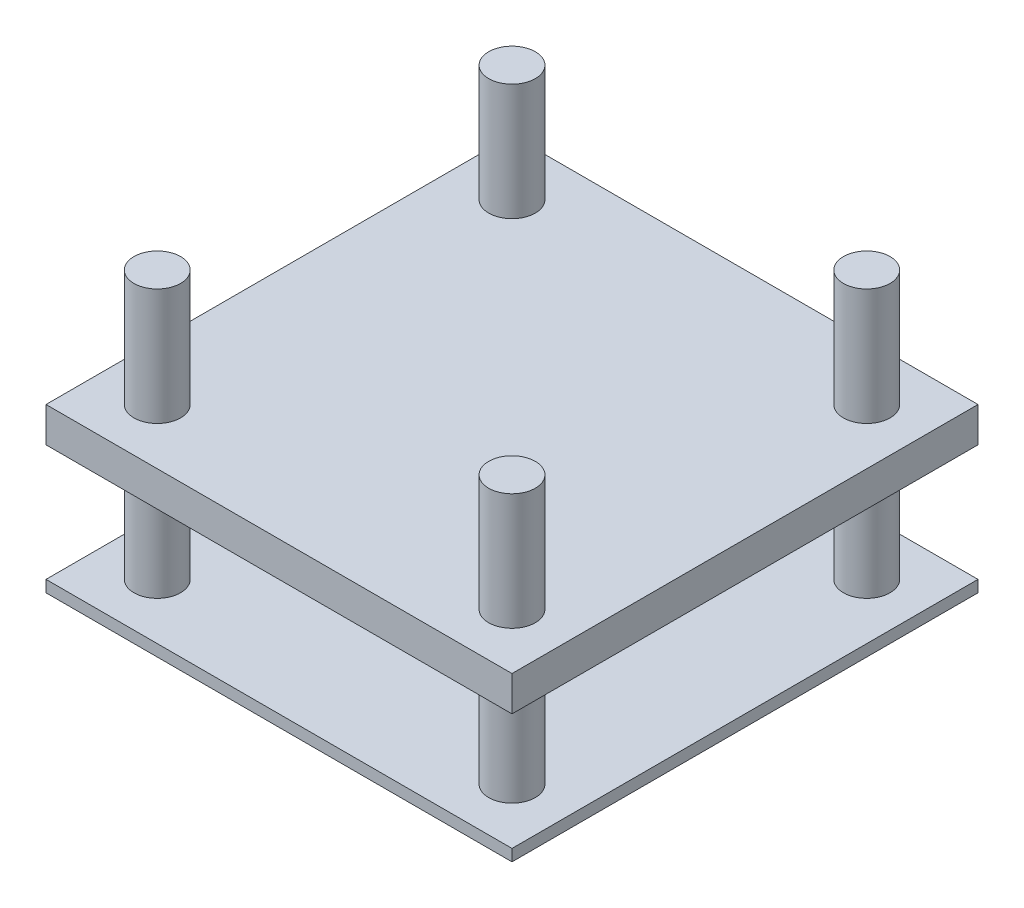
ISO-10303-21;
HEADER;
FILE_DESCRIPTION(('STEP AP214'),'2;1');
FILE_NAME('part.step','',(''),(''),'','','');
FILE_SCHEMA(('AUTOMOTIVE_DESIGN { 1 0 10303 214 1 1 1 1 }'));
ENDSEC;
DATA;
#1=APPLICATION_CONTEXT('core data for automotive mechanical design processes');
#2=APPLICATION_PROTOCOL_DEFINITION('international standard','automotive_design',2000,#1);
#3=PRODUCT_CONTEXT('',#1,'mechanical');
#4=PRODUCT('Part','Part','',(#3));
#5=PRODUCT_RELATED_PRODUCT_CATEGORY('part','',(#4));
#6=PRODUCT_DEFINITION_FORMATION('','',#4);
#7=PRODUCT_DEFINITION_CONTEXT('part definition',#1,'design');
#8=PRODUCT_DEFINITION('design','',#6,#7);
#9=PRODUCT_DEFINITION_SHAPE('','',#8);
#10=(LENGTH_UNIT() NAMED_UNIT(*) SI_UNIT(.MILLI.,.METRE.));
#11=(NAMED_UNIT(*) PLANE_ANGLE_UNIT() SI_UNIT($,.RADIAN.));
#12=(NAMED_UNIT(*) SI_UNIT($,.STERADIAN.) SOLID_ANGLE_UNIT());
#13=UNCERTAINTY_MEASURE_WITH_UNIT(LENGTH_MEASURE(1.E-05),#10,'distance_accuracy_value','');
#14=(GEOMETRIC_REPRESENTATION_CONTEXT(3) GLOBAL_UNCERTAINTY_ASSIGNED_CONTEXT((#13)) GLOBAL_UNIT_ASSIGNED_CONTEXT((#10,
#11,#12)) REPRESENTATION_CONTEXT('',''));
#15=CARTESIAN_POINT('',(0.,0.,0.));
#16=DIRECTION('',(0.,0.,1.));
#17=DIRECTION('',(1.,0.,0.));
#18=AXIS2_PLACEMENT_3D('',#15,#16,#17);
#19=CARTESIAN_POINT('',(0.,1.,0.));
#20=DIRECTION('',(0.,1.,0.));
#21=DIRECTION('',(0.,0.,1.));
#22=AXIS2_PLACEMENT_3D('',#19,#20,#21);
#23=PLANE('',#22);
#24=CARTESIAN_POINT('',(-15.2247989874837,1.,-15.2247989874837));
#25=DIRECTION('',(0.,1.,0.));
#26=DIRECTION('',(0.,0.,1.));
#27=AXIS2_PLACEMENT_3D('',#24,#25,#26);
#28=CIRCLE('',#27,2.);
#29=CARTESIAN_POINT('',(-15.2247989874837,1.,-13.2247989874837));
#30=VERTEX_POINT('',#29);
#31=EDGE_CURVE('E248',#30,#30,#28,.F.);
#32=ORIENTED_EDGE('',*,*,#31,.T.);
#33=EDGE_LOOP('',(#32));
#34=FACE_BOUND('',#33,.T.);
#35=CARTESIAN_POINT('',(15.2247989874837,1.,-15.2247989874837));
#36=DIRECTION('',(0.,1.,0.));
#37=DIRECTION('',(0.,0.,1.));
#38=AXIS2_PLACEMENT_3D('',#35,#36,#37);
#39=CIRCLE('',#38,2.);
#40=CARTESIAN_POINT('',(15.2247989874837,1.,-13.2247989874837));
#41=VERTEX_POINT('',#40);
#42=EDGE_CURVE('E245',#41,#41,#39,.F.);
#43=ORIENTED_EDGE('',*,*,#42,.T.);
#44=EDGE_LOOP('',(#43));
#45=FACE_BOUND('',#44,.T.);
#46=CARTESIAN_POINT('',(15.2247989874837,1.,15.2247989874837));
#47=DIRECTION('',(0.,1.,0.));
#48=DIRECTION('',(0.,0.,1.));
#49=AXIS2_PLACEMENT_3D('',#46,#47,#48);
#50=CIRCLE('',#49,2.);
#51=CARTESIAN_POINT('',(15.2247989874837,1.,17.2247989874837));
#52=VERTEX_POINT('',#51);
#53=EDGE_CURVE('E242',#52,#52,#50,.F.);
#54=ORIENTED_EDGE('',*,*,#53,.T.);
#55=EDGE_LOOP('',(#54));
#56=FACE_BOUND('',#55,.T.);
#57=CARTESIAN_POINT('',(-15.2247989874837,1.,15.2247989874837));
#58=DIRECTION('',(0.,1.,0.));
#59=DIRECTION('',(0.,0.,1.));
#60=AXIS2_PLACEMENT_3D('',#57,#58,#59);
#61=CIRCLE('',#60,2.);
#62=CARTESIAN_POINT('',(-15.2247989874837,1.,17.2247989874837));
#63=VERTEX_POINT('',#62);
#64=EDGE_CURVE('E251',#63,#63,#61,.F.);
#65=ORIENTED_EDGE('',*,*,#64,.T.);
#66=EDGE_LOOP('',(#65));
#67=FACE_BOUND('',#66,.T.);
#68=DIRECTION('',(1.,0.,0.));
#69=VECTOR('',#68,1.);
#70=CARTESIAN_POINT('',(-20.,1.,20.));
#71=LINE('',#70,#69);
#72=CARTESIAN_POINT('',(-20.,1.,20.));
#73=VERTEX_POINT('',#72);
#74=CARTESIAN_POINT('',(20.,1.,20.));
#75=VERTEX_POINT('',#74);
#76=EDGE_CURVE('E255',#73,#75,#71,.T.);
#77=ORIENTED_EDGE('',*,*,#76,.T.);
#78=DIRECTION('',(0.,0.,-1.));
#79=VECTOR('',#78,1.);
#80=CARTESIAN_POINT('',(20.,1.,20.));
#81=LINE('',#80,#79);
#82=CARTESIAN_POINT('',(20.,1.,-20.));
#83=VERTEX_POINT('',#82);
#84=EDGE_CURVE('E258',#75,#83,#81,.T.);
#85=ORIENTED_EDGE('',*,*,#84,.T.);
#86=DIRECTION('',(1.,0.,0.));
#87=VECTOR('',#86,1.);
#88=CARTESIAN_POINT('',(-20.,1.,-20.));
#89=LINE('',#88,#87);
#90=CARTESIAN_POINT('',(-20.,1.,-20.));
#91=VERTEX_POINT('',#90);
#92=EDGE_CURVE('E261',#91,#83,#89,.T.);
#93=ORIENTED_EDGE('',*,*,#92,.F.);
#94=DIRECTION('',(0.,0.,-1.));
#95=VECTOR('',#94,1.);
#96=CARTESIAN_POINT('',(-20.,1.,20.));
#97=LINE('',#96,#95);
#98=EDGE_CURVE('E264',#73,#91,#97,.T.);
#99=ORIENTED_EDGE('',*,*,#98,.F.);
#100=EDGE_LOOP('',(#77,#85,#93,#99));
#101=FACE_BOUND('',#100,.T.);
#102=DIRECTION('',(0.,0.,1.));
#103=VECTOR('',#102,1.);
#104=CARTESIAN_POINT('',(9.75,1.,0.));
#105=LINE('',#104,#103);
#106=CARTESIAN_POINT('',(9.75,0.999999999999999,-9.75));
#107=VERTEX_POINT('',#106);
#108=CARTESIAN_POINT('',(9.75,0.999999999999999,9.75));
#109=VERTEX_POINT('',#108);
#110=EDGE_CURVE('E158',#107,#109,#105,.T.);
#111=ORIENTED_EDGE('',*,*,#110,.T.);
#112=DIRECTION('',(-1.,0.,0.));
#113=VECTOR('',#112,1.);
#114=CARTESIAN_POINT('',(0.,1.,9.75));
#115=LINE('',#114,#113);
#116=CARTESIAN_POINT('',(-9.75,0.999999999999999,9.75));
#117=VERTEX_POINT('',#116);
#118=EDGE_CURVE('E129',#109,#117,#115,.T.);
#119=ORIENTED_EDGE('',*,*,#118,.T.);
#120=DIRECTION('',(0.,0.,1.));
#121=VECTOR('',#120,1.);
#122=CARTESIAN_POINT('',(-9.75,1.,0.));
#123=LINE('',#122,#121);
#124=CARTESIAN_POINT('',(-9.75,1.,-9.75));
#125=VERTEX_POINT('',#124);
#126=EDGE_CURVE('E132',#125,#117,#123,.T.);
#127=ORIENTED_EDGE('',*,*,#126,.F.);
#128=DIRECTION('',(-1.,0.,0.));
#129=VECTOR('',#128,1.);
#130=CARTESIAN_POINT('',(0.,1.,-9.75));
#131=LINE('',#130,#129);
#132=EDGE_CURVE('E156',#107,#125,#131,.T.);
#133=ORIENTED_EDGE('',*,*,#132,.F.);
#134=EDGE_LOOP('',(#111,#119,#127,#133));
#135=FACE_BOUND('',#134,.T.);
#136=ADVANCED_FACE('F37',(#34,#45,#56,#67,#101,#135),#23,.T.);
#137=CARTESIAN_POINT('',(0.,0.,0.));
#138=DIRECTION('',(0.,1.,0.));
#139=DIRECTION('',(0.,0.,1.));
#140=AXIS2_PLACEMENT_3D('',#137,#138,#139);
#141=PLANE('',#140);
#142=DIRECTION('',(1.,0.,0.));
#143=VECTOR('',#142,1.);
#144=CARTESIAN_POINT('',(-20.,0.,20.));
#145=LINE('',#144,#143);
#146=CARTESIAN_POINT('',(-20.,0.,20.));
#147=VERTEX_POINT('',#146);
#148=CARTESIAN_POINT('',(20.,0.,20.));
#149=VERTEX_POINT('',#148);
#150=EDGE_CURVE('E254',#147,#149,#145,.T.);
#151=ORIENTED_EDGE('',*,*,#150,.F.);
#152=DIRECTION('',(0.,0.,-1.));
#153=VECTOR('',#152,1.);
#154=CARTESIAN_POINT('',(-20.,0.,20.));
#155=LINE('',#154,#153);
#156=CARTESIAN_POINT('',(-20.,0.,-20.));
#157=VERTEX_POINT('',#156);
#158=EDGE_CURVE('E259',#147,#157,#155,.T.);
#159=ORIENTED_EDGE('',*,*,#158,.T.);
#160=DIRECTION('',(1.,0.,0.));
#161=VECTOR('',#160,1.);
#162=CARTESIAN_POINT('',(-20.,0.,-20.));
#163=LINE('',#162,#161);
#164=CARTESIAN_POINT('',(20.,0.,-20.));
#165=VERTEX_POINT('',#164);
#166=EDGE_CURVE('E273',#157,#165,#163,.T.);
#167=ORIENTED_EDGE('',*,*,#166,.T.);
#168=DIRECTION('',(0.,0.,-1.));
#169=VECTOR('',#168,1.);
#170=CARTESIAN_POINT('',(20.,0.,20.));
#171=LINE('',#170,#169);
#172=EDGE_CURVE('E270',#149,#165,#171,.T.);
#173=ORIENTED_EDGE('',*,*,#172,.F.);
#174=EDGE_LOOP('',(#151,#159,#167,#173));
#175=FACE_BOUND('',#174,.T.);
#176=CARTESIAN_POINT('',(15.2247989874837,0.,-15.2247989874837));
#177=DIRECTION('',(0.,1.,0.));
#178=DIRECTION('',(0.,0.,1.));
#179=AXIS2_PLACEMENT_3D('',#176,#177,#178);
#180=CIRCLE('',#179,2.);
#181=CARTESIAN_POINT('',(15.2247989874837,0.,-13.2247989874837));
#182=VERTEX_POINT('',#181);
#183=EDGE_CURVE('E170',#182,#182,#180,.T.);
#184=ORIENTED_EDGE('',*,*,#183,.T.);
#185=EDGE_LOOP('',(#184));
#186=FACE_BOUND('',#185,.T.);
#187=CARTESIAN_POINT('',(-15.2247989874837,0.,-15.2247989874837));
#188=DIRECTION('',(0.,1.,0.));
#189=DIRECTION('',(0.,0.,1.));
#190=AXIS2_PLACEMENT_3D('',#187,#188,#189);
#191=CIRCLE('',#190,2.);
#192=CARTESIAN_POINT('',(-15.2247989874837,0.,-13.2247989874837));
#193=VERTEX_POINT('',#192);
#194=EDGE_CURVE('E286',#193,#193,#191,.F.);
#195=ORIENTED_EDGE('',*,*,#194,.F.);
#196=EDGE_LOOP('',(#195));
#197=FACE_BOUND('',#196,.T.);
#198=CARTESIAN_POINT('',(-15.2247989874837,0.,15.2247989874837));
#199=DIRECTION('',(0.,1.,0.));
#200=DIRECTION('',(0.,0.,1.));
#201=AXIS2_PLACEMENT_3D('',#198,#199,#200);
#202=CIRCLE('',#201,2.);
#203=CARTESIAN_POINT('',(-15.2247989874837,0.,17.2247989874837));
#204=VERTEX_POINT('',#203);
#205=EDGE_CURVE('E45',#204,#204,#202,.F.);
#206=ORIENTED_EDGE('',*,*,#205,.F.);
#207=EDGE_LOOP('',(#206));
#208=FACE_BOUND('',#207,.T.);
#209=CARTESIAN_POINT('',(15.2247989874837,0.,15.2247989874837));
#210=DIRECTION('',(0.,1.,0.));
#211=DIRECTION('',(0.,0.,1.));
#212=AXIS2_PLACEMENT_3D('',#209,#210,#211);
#213=CIRCLE('',#212,2.);
#214=CARTESIAN_POINT('',(15.2247989874837,0.,17.2247989874837));
#215=VERTEX_POINT('',#214);
#216=EDGE_CURVE('E11',#215,#215,#213,.F.);
#217=ORIENTED_EDGE('',*,*,#216,.F.);
#218=EDGE_LOOP('',(#217));
#219=FACE_BOUND('',#218,.T.);
#220=DIRECTION('',(1.,0.,0.));
#221=VECTOR('',#220,1.);
#222=CARTESIAN_POINT('',(-9.75,0.,9.75));
#223=LINE('',#222,#221);
#224=CARTESIAN_POINT('',(-9.75,0.,9.75));
#225=VERTEX_POINT('',#224);
#226=CARTESIAN_POINT('',(9.75,0.,9.75));
#227=VERTEX_POINT('',#226);
#228=EDGE_CURVE('E60',#225,#227,#223,.T.);
#229=ORIENTED_EDGE('',*,*,#228,.T.);
#230=DIRECTION('',(0.,0.,-1.));
#231=VECTOR('',#230,1.);
#232=CARTESIAN_POINT('',(9.75,0.,9.75));
#233=LINE('',#232,#231);
#234=CARTESIAN_POINT('',(9.75,0.,-9.75));
#235=VERTEX_POINT('',#234);
#236=EDGE_CURVE('E136',#227,#235,#233,.T.);
#237=ORIENTED_EDGE('',*,*,#236,.T.);
#238=DIRECTION('',(1.,0.,0.));
#239=VECTOR('',#238,1.);
#240=CARTESIAN_POINT('',(-9.75,0.,-9.75));
#241=LINE('',#240,#239);
#242=CARTESIAN_POINT('',(-9.75,0.,-9.75));
#243=VERTEX_POINT('',#242);
#244=EDGE_CURVE('E142',#243,#235,#241,.T.);
#245=ORIENTED_EDGE('',*,*,#244,.F.);
#246=DIRECTION('',(0.,0.,-1.));
#247=VECTOR('',#246,1.);
#248=CARTESIAN_POINT('',(-9.75,0.,9.75));
#249=LINE('',#248,#247);
#250=EDGE_CURVE('E146',#225,#243,#249,.T.);
#251=ORIENTED_EDGE('',*,*,#250,.F.);
#252=EDGE_LOOP('',(#229,#237,#245,#251));
#253=FACE_BOUND('',#252,.T.);
#254=ADVANCED_FACE('F145',(#175,#186,#197,#208,#219,#253),#141,.F.);
#255=CARTESIAN_POINT('',(-20.,1.,20.));
#256=DIRECTION('',(0.,0.,-1.));
#257=DIRECTION('',(-1.,0.,0.));
#258=AXIS2_PLACEMENT_3D('',#255,#256,#257);
#259=PLANE('',#258);
#260=ORIENTED_EDGE('',*,*,#150,.T.);
#261=DIRECTION('',(0.,-1.,0.));
#262=VECTOR('',#261,1.);
#263=CARTESIAN_POINT('',(20.,1.,20.));
#264=LINE('',#263,#262);
#265=EDGE_CURVE('E283',#75,#149,#264,.T.);
#266=ORIENTED_EDGE('',*,*,#265,.F.);
#267=ORIENTED_EDGE('',*,*,#76,.F.);
#268=DIRECTION('',(0.,-1.,0.));
#269=VECTOR('',#268,1.);
#270=CARTESIAN_POINT('',(-20.,1.,20.));
#271=LINE('',#270,#269);
#272=EDGE_CURVE('E267',#73,#147,#271,.T.);
#273=ORIENTED_EDGE('',*,*,#272,.T.);
#274=EDGE_LOOP('',(#260,#266,#267,#273));
#275=FACE_BOUND('',#274,.T.);
#276=ADVANCED_FACE('F39',(#275),#259,.F.);
#277=CARTESIAN_POINT('',(20.,1.,20.));
#278=DIRECTION('',(-1.,0.,0.));
#279=DIRECTION('',(0.,0.,1.));
#280=AXIS2_PLACEMENT_3D('',#277,#278,#279);
#281=PLANE('',#280);
#282=ORIENTED_EDGE('',*,*,#172,.T.);
#283=DIRECTION('',(0.,-1.,0.));
#284=VECTOR('',#283,1.);
#285=CARTESIAN_POINT('',(20.,1.,-20.));
#286=LINE('',#285,#284);
#287=EDGE_CURVE('E281',#83,#165,#286,.T.);
#288=ORIENTED_EDGE('',*,*,#287,.F.);
#289=ORIENTED_EDGE('',*,*,#84,.F.);
#290=ORIENTED_EDGE('',*,*,#265,.T.);
#291=EDGE_LOOP('',(#282,#288,#289,#290));
#292=FACE_BOUND('',#291,.T.);
#293=ADVANCED_FACE('F331',(#292),#281,.F.);
#294=CARTESIAN_POINT('',(-20.,1.,-20.));
#295=DIRECTION('',(0.,0.,-1.));
#296=DIRECTION('',(-1.,0.,0.));
#297=AXIS2_PLACEMENT_3D('',#294,#295,#296);
#298=PLANE('',#297);
#299=ORIENTED_EDGE('',*,*,#166,.F.);
#300=DIRECTION('',(0.,-1.,0.));
#301=VECTOR('',#300,1.);
#302=CARTESIAN_POINT('',(-20.,1.,-20.));
#303=LINE('',#302,#301);
#304=EDGE_CURVE('E279',#91,#157,#303,.T.);
#305=ORIENTED_EDGE('',*,*,#304,.F.);
#306=ORIENTED_EDGE('',*,*,#92,.T.);
#307=ORIENTED_EDGE('',*,*,#287,.T.);
#308=EDGE_LOOP('',(#299,#305,#306,#307));
#309=FACE_BOUND('',#308,.T.);
#310=ADVANCED_FACE('F328',(#309),#298,.T.);
#311=CARTESIAN_POINT('',(-20.,1.,20.));
#312=DIRECTION('',(-1.,0.,0.));
#313=DIRECTION('',(0.,0.,1.));
#314=AXIS2_PLACEMENT_3D('',#311,#312,#313);
#315=PLANE('',#314);
#316=ORIENTED_EDGE('',*,*,#158,.F.);
#317=ORIENTED_EDGE('',*,*,#272,.F.);
#318=ORIENTED_EDGE('',*,*,#98,.T.);
#319=ORIENTED_EDGE('',*,*,#304,.T.);
#320=EDGE_LOOP('',(#316,#317,#318,#319));
#321=FACE_BOUND('',#320,.T.);
#322=ADVANCED_FACE('F325',(#321),#315,.T.);
#323=CARTESIAN_POINT('',(20.,14.,20.));
#324=DIRECTION('',(-1.,0.,0.));
#325=DIRECTION('',(0.,0.,1.));
#326=AXIS2_PLACEMENT_3D('',#323,#324,#325);
#327=PLANE('',#326);
#328=DIRECTION('',(0.,0.,-1.));
#329=VECTOR('',#328,1.);
#330=CARTESIAN_POINT('',(20.,11.,20.));
#331=LINE('',#330,#329);
#332=CARTESIAN_POINT('',(20.,11.,20.));
#333=VERTEX_POINT('',#332);
#334=CARTESIAN_POINT('',(20.,11.,-20.));
#335=VERTEX_POINT('',#334);
#336=EDGE_CURVE('E200',#333,#335,#331,.T.);
#337=ORIENTED_EDGE('',*,*,#336,.T.);
#338=DIRECTION('',(0.,-1.,0.));
#339=VECTOR('',#338,1.);
#340=CARTESIAN_POINT('',(20.,14.,-20.));
#341=LINE('',#340,#339);
#342=CARTESIAN_POINT('',(20.,14.,-20.));
#343=VERTEX_POINT('',#342);
#344=EDGE_CURVE('E227',#343,#335,#341,.T.);
#345=ORIENTED_EDGE('',*,*,#344,.F.);
#346=DIRECTION('',(0.,0.,-1.));
#347=VECTOR('',#346,1.);
#348=CARTESIAN_POINT('',(20.,14.,20.));
#349=LINE('',#348,#347);
#350=CARTESIAN_POINT('',(20.,14.,20.));
#351=VERTEX_POINT('',#350);
#352=EDGE_CURVE('E201',#351,#343,#349,.T.);
#353=ORIENTED_EDGE('',*,*,#352,.F.);
#354=DIRECTION('',(0.,-1.,0.));
#355=VECTOR('',#354,1.);
#356=CARTESIAN_POINT('',(20.,14.,20.));
#357=LINE('',#356,#355);
#358=EDGE_CURVE('E211',#351,#333,#357,.T.);
#359=ORIENTED_EDGE('',*,*,#358,.T.);
#360=EDGE_LOOP('',(#337,#345,#353,#359));
#361=FACE_BOUND('',#360,.T.);
#362=ADVANCED_FACE('F322',(#361),#327,.F.);
#363=CARTESIAN_POINT('',(20.,14.,-20.));
#364=DIRECTION('',(0.,0.,1.));
#365=DIRECTION('',(1.,0.,0.));
#366=AXIS2_PLACEMENT_3D('',#363,#364,#365);
#367=PLANE('',#366);
#368=DIRECTION('',(-1.,0.,0.));
#369=VECTOR('',#368,1.);
#370=CARTESIAN_POINT('',(20.,11.,-20.));
#371=LINE('',#370,#369);
#372=CARTESIAN_POINT('',(-20.,11.,-20.));
#373=VERTEX_POINT('',#372);
#374=EDGE_CURVE('E214',#335,#373,#371,.T.);
#375=ORIENTED_EDGE('',*,*,#374,.T.);
#376=DIRECTION('',(0.,-1.,0.));
#377=VECTOR('',#376,1.);
#378=CARTESIAN_POINT('',(-20.,14.,-20.));
#379=LINE('',#378,#377);
#380=CARTESIAN_POINT('',(-20.,14.,-20.));
#381=VERTEX_POINT('',#380);
#382=EDGE_CURVE('E224',#381,#373,#379,.T.);
#383=ORIENTED_EDGE('',*,*,#382,.F.);
#384=DIRECTION('',(-1.,0.,0.));
#385=VECTOR('',#384,1.);
#386=CARTESIAN_POINT('',(20.,14.,-20.));
#387=LINE('',#386,#385);
#388=EDGE_CURVE('E204',#343,#381,#387,.T.);
#389=ORIENTED_EDGE('',*,*,#388,.F.);
#390=ORIENTED_EDGE('',*,*,#344,.T.);
#391=EDGE_LOOP('',(#375,#383,#389,#390));
#392=FACE_BOUND('',#391,.T.);
#393=ADVANCED_FACE('F650',(#392),#367,.F.);
#394=CARTESIAN_POINT('',(-20.,14.,20.));
#395=DIRECTION('',(1.,0.,0.));
#396=DIRECTION('',(0.,0.,-1.));
#397=AXIS2_PLACEMENT_3D('',#394,#395,#396);
#398=PLANE('',#397);
#399=DIRECTION('',(0.,0.,1.));
#400=VECTOR('',#399,1.);
#401=CARTESIAN_POINT('',(-20.,11.,20.));
#402=LINE('',#401,#400);
#403=CARTESIAN_POINT('',(-20.,11.,20.));
#404=VERTEX_POINT('',#403);
#405=EDGE_CURVE('E216',#373,#404,#402,.T.);
#406=ORIENTED_EDGE('',*,*,#405,.T.);
#407=DIRECTION('',(0.,-1.,0.));
#408=VECTOR('',#407,1.);
#409=CARTESIAN_POINT('',(-20.,14.,20.));
#410=LINE('',#409,#408);
#411=CARTESIAN_POINT('',(-20.,14.,20.));
#412=VERTEX_POINT('',#411);
#413=EDGE_CURVE('E221',#412,#404,#410,.T.);
#414=ORIENTED_EDGE('',*,*,#413,.F.);
#415=DIRECTION('',(0.,0.,1.));
#416=VECTOR('',#415,1.);
#417=CARTESIAN_POINT('',(-20.,14.,20.));
#418=LINE('',#417,#416);
#419=EDGE_CURVE('E207',#381,#412,#418,.T.);
#420=ORIENTED_EDGE('',*,*,#419,.F.);
#421=ORIENTED_EDGE('',*,*,#382,.T.);
#422=EDGE_LOOP('',(#406,#414,#420,#421));
#423=FACE_BOUND('',#422,.T.);
#424=ADVANCED_FACE('F641',(#423),#398,.F.);
#425=CARTESIAN_POINT('',(20.,14.,20.));
#426=DIRECTION('',(0.,0.,-1.));
#427=DIRECTION('',(-1.,0.,0.));
#428=AXIS2_PLACEMENT_3D('',#425,#426,#427);
#429=PLANE('',#428);
#430=DIRECTION('',(1.,0.,0.));
#431=VECTOR('',#430,1.);
#432=CARTESIAN_POINT('',(20.,11.,20.));
#433=LINE('',#432,#431);
#434=EDGE_CURVE('E205',#404,#333,#433,.T.);
#435=ORIENTED_EDGE('',*,*,#434,.T.);
#436=ORIENTED_EDGE('',*,*,#358,.F.);
#437=DIRECTION('',(1.,0.,0.));
#438=VECTOR('',#437,1.);
#439=CARTESIAN_POINT('',(20.,14.,20.));
#440=LINE('',#439,#438);
#441=EDGE_CURVE('E209',#412,#351,#440,.T.);
#442=ORIENTED_EDGE('',*,*,#441,.F.);
#443=ORIENTED_EDGE('',*,*,#413,.T.);
#444=EDGE_LOOP('',(#435,#436,#442,#443));
#445=FACE_BOUND('',#444,.T.);
#446=ADVANCED_FACE('F632',(#445),#429,.F.);
#447=CARTESIAN_POINT('',(0.,14.,0.));
#448=DIRECTION('',(0.,1.,0.));
#449=DIRECTION('',(0.,0.,1.));
#450=AXIS2_PLACEMENT_3D('',#447,#448,#449);
#451=PLANE('',#450);
#452=CARTESIAN_POINT('',(15.2247989874837,14.,15.2247989874837));
#453=DIRECTION('',(0.,1.,0.));
#454=DIRECTION('',(0.,0.,1.));
#455=AXIS2_PLACEMENT_3D('',#452,#453,#454);
#456=CIRCLE('',#455,2.);
#457=CARTESIAN_POINT('',(15.2247989874837,14.,17.2247989874837));
#458=VERTEX_POINT('',#457);
#459=EDGE_CURVE('E179',#458,#458,#456,.F.);
#460=ORIENTED_EDGE('',*,*,#459,.T.);
#461=EDGE_LOOP('',(#460));
#462=FACE_BOUND('',#461,.T.);
#463=CARTESIAN_POINT('',(15.2247989874837,14.,-15.2247989874837));
#464=DIRECTION('',(0.,1.,0.));
#465=DIRECTION('',(0.,0.,1.));
#466=AXIS2_PLACEMENT_3D('',#463,#464,#465);
#467=CIRCLE('',#466,2.);
#468=CARTESIAN_POINT('',(15.2247989874837,14.,-13.2247989874837));
#469=VERTEX_POINT('',#468);
#470=EDGE_CURVE('E185',#469,#469,#467,.F.);
#471=ORIENTED_EDGE('',*,*,#470,.T.);
#472=EDGE_LOOP('',(#471));
#473=FACE_BOUND('',#472,.T.);
#474=CARTESIAN_POINT('',(-15.2247989874837,14.,-15.2247989874837));
#475=DIRECTION('',(0.,1.,0.));
#476=DIRECTION('',(0.,0.,1.));
#477=AXIS2_PLACEMENT_3D('',#474,#475,#476);
#478=CIRCLE('',#477,2.);
#479=CARTESIAN_POINT('',(-15.2247989874837,14.,-13.2247989874837));
#480=VERTEX_POINT('',#479);
#481=EDGE_CURVE('E191',#480,#480,#478,.F.);
#482=ORIENTED_EDGE('',*,*,#481,.T.);
#483=EDGE_LOOP('',(#482));
#484=FACE_BOUND('',#483,.T.);
#485=CARTESIAN_POINT('',(-15.2247989874837,14.,15.2247989874837));
#486=DIRECTION('',(0.,1.,0.));
#487=DIRECTION('',(0.,0.,1.));
#488=AXIS2_PLACEMENT_3D('',#485,#486,#487);
#489=CIRCLE('',#488,2.);
#490=CARTESIAN_POINT('',(-15.2247989874837,14.,17.2247989874837));
#491=VERTEX_POINT('',#490);
#492=EDGE_CURVE('E197',#491,#491,#489,.F.);
#493=ORIENTED_EDGE('',*,*,#492,.T.);
#494=EDGE_LOOP('',(#493));
#495=FACE_BOUND('',#494,.T.);
#496=ORIENTED_EDGE('',*,*,#352,.T.);
#497=ORIENTED_EDGE('',*,*,#388,.T.);
#498=ORIENTED_EDGE('',*,*,#419,.T.);
#499=ORIENTED_EDGE('',*,*,#441,.T.);
#500=EDGE_LOOP('',(#496,#497,#498,#499));
#501=FACE_BOUND('',#500,.T.);
#502=ADVANCED_FACE('F623',(#462,#473,#484,#495,#501),#451,.T.);
#503=CARTESIAN_POINT('',(0.,11.,0.));
#504=DIRECTION('',(0.,1.,0.));
#505=DIRECTION('',(0.,0.,1.));
#506=AXIS2_PLACEMENT_3D('',#503,#504,#505);
#507=PLANE('',#506);
#508=CARTESIAN_POINT('',(15.2247989874837,11.,15.2247989874837));
#509=DIRECTION('',(0.,1.,0.));
#510=DIRECTION('',(0.,0.,1.));
#511=AXIS2_PLACEMENT_3D('',#508,#509,#510);
#512=CIRCLE('',#511,2.);
#513=CARTESIAN_POINT('',(15.2247989874837,11.,17.2247989874837));
#514=VERTEX_POINT('',#513);
#515=EDGE_CURVE('E239',#514,#514,#512,.F.);
#516=ORIENTED_EDGE('',*,*,#515,.F.);
#517=EDGE_LOOP('',(#516));
#518=FACE_BOUND('',#517,.T.);
#519=CARTESIAN_POINT('',(15.2247989874837,11.,-15.2247989874837));
#520=DIRECTION('',(0.,1.,0.));
#521=DIRECTION('',(0.,0.,1.));
#522=AXIS2_PLACEMENT_3D('',#519,#520,#521);
#523=CIRCLE('',#522,2.);
#524=CARTESIAN_POINT('',(15.2247989874837,11.,-13.2247989874837));
#525=VERTEX_POINT('',#524);
#526=EDGE_CURVE('E236',#525,#525,#523,.F.);
#527=ORIENTED_EDGE('',*,*,#526,.F.);
#528=EDGE_LOOP('',(#527));
#529=FACE_BOUND('',#528,.T.);
#530=CARTESIAN_POINT('',(-15.2247989874837,11.,-15.2247989874837));
#531=DIRECTION('',(0.,1.,0.));
#532=DIRECTION('',(0.,0.,1.));
#533=AXIS2_PLACEMENT_3D('',#530,#531,#532);
#534=CIRCLE('',#533,2.);
#535=CARTESIAN_POINT('',(-15.2247989874837,11.,-13.2247989874837));
#536=VERTEX_POINT('',#535);
#537=EDGE_CURVE('E233',#536,#536,#534,.F.);
#538=ORIENTED_EDGE('',*,*,#537,.F.);
#539=EDGE_LOOP('',(#538));
#540=FACE_BOUND('',#539,.T.);
#541=CARTESIAN_POINT('',(-15.2247989874837,11.,15.2247989874837));
#542=DIRECTION('',(0.,1.,0.));
#543=DIRECTION('',(0.,0.,1.));
#544=AXIS2_PLACEMENT_3D('',#541,#542,#543);
#545=CIRCLE('',#544,2.);
#546=CARTESIAN_POINT('',(-15.2247989874837,11.,17.2247989874837));
#547=VERTEX_POINT('',#546);
#548=EDGE_CURVE('E230',#547,#547,#545,.F.);
#549=ORIENTED_EDGE('',*,*,#548,.F.);
#550=EDGE_LOOP('',(#549));
#551=FACE_BOUND('',#550,.T.);
#552=ORIENTED_EDGE('',*,*,#336,.F.);
#553=ORIENTED_EDGE('',*,*,#434,.F.);
#554=ORIENTED_EDGE('',*,*,#405,.F.);
#555=ORIENTED_EDGE('',*,*,#374,.F.);
#556=EDGE_LOOP('',(#552,#553,#554,#555));
#557=FACE_BOUND('',#556,.T.);
#558=ADVANCED_FACE('F615',(#518,#529,#540,#551,#557),#507,.F.);
#559=CARTESIAN_POINT('',(-15.2247989874837,24.,15.2247989874837));
#560=DIRECTION('',(0.,-1.,0.));
#561=DIRECTION('',(0.,0.,-1.));
#562=AXIS2_PLACEMENT_3D('',#559,#560,#561);
#563=CYLINDRICAL_SURFACE('',#562,2.);
#564=ORIENTED_EDGE('',*,*,#64,.F.);
#565=EDGE_LOOP('',(#564));
#566=FACE_BOUND('',#565,.T.);
#567=ORIENTED_EDGE('',*,*,#548,.T.);
#568=EDGE_LOOP('',(#567));
#569=FACE_BOUND('',#568,.T.);
#570=ADVANCED_FACE('F606',(#566,#569),#563,.T.);
#571=ORIENTED_EDGE('',*,*,#492,.F.);
#572=EDGE_LOOP('',(#571));
#573=FACE_BOUND('',#572,.T.);
#574=CARTESIAN_POINT('',(-15.2247989874837,24.,15.2247989874837));
#575=DIRECTION('',(0.,1.,0.));
#576=DIRECTION('',(0.,0.,1.));
#577=AXIS2_PLACEMENT_3D('',#574,#575,#576);
#578=CIRCLE('',#577,2.);
#579=CARTESIAN_POINT('',(-15.2247989874837,24.,17.2247989874837));
#580=VERTEX_POINT('',#579);
#581=EDGE_CURVE('E194',#580,#580,#578,.T.);
#582=ORIENTED_EDGE('',*,*,#581,.F.);
#583=EDGE_LOOP('',(#582));
#584=FACE_BOUND('',#583,.T.);
#585=ADVANCED_FACE('F597',(#573,#584),#563,.T.);
#586=CARTESIAN_POINT('',(-15.2247989874837,24.,15.2247989874837));
#587=DIRECTION('',(0.,1.,0.));
#588=DIRECTION('',(0.,0.,1.));
#589=AXIS2_PLACEMENT_3D('',#586,#587,#588);
#590=PLANE('',#589);
#591=ORIENTED_EDGE('',*,*,#581,.T.);
#592=EDGE_LOOP('',(#591));
#593=FACE_BOUND('',#592,.T.);
#594=ADVANCED_FACE('F467',(#593),#590,.T.);
#595=CARTESIAN_POINT('',(-15.2247989874837,24.,-15.2247989874837));
#596=DIRECTION('',(0.,-1.,0.));
#597=DIRECTION('',(0.,0.,-1.));
#598=AXIS2_PLACEMENT_3D('',#595,#596,#597);
#599=CYLINDRICAL_SURFACE('',#598,2.);
#600=ORIENTED_EDGE('',*,*,#31,.F.);
#601=EDGE_LOOP('',(#600));
#602=FACE_BOUND('',#601,.T.);
#603=ORIENTED_EDGE('',*,*,#537,.T.);
#604=EDGE_LOOP('',(#603));
#605=FACE_BOUND('',#604,.T.);
#606=ADVANCED_FACE('F427',(#602,#605),#599,.T.);
#607=ORIENTED_EDGE('',*,*,#481,.F.);
#608=EDGE_LOOP('',(#607));
#609=FACE_BOUND('',#608,.T.);
#610=CARTESIAN_POINT('',(-15.2247989874837,24.,-15.2247989874837));
#611=DIRECTION('',(0.,1.,0.));
#612=DIRECTION('',(0.,0.,1.));
#613=AXIS2_PLACEMENT_3D('',#610,#611,#612);
#614=CIRCLE('',#613,2.);
#615=CARTESIAN_POINT('',(-15.2247989874837,24.,-13.2247989874837));
#616=VERTEX_POINT('',#615);
#617=EDGE_CURVE('E188',#616,#616,#614,.T.);
#618=ORIENTED_EDGE('',*,*,#617,.F.);
#619=EDGE_LOOP('',(#618));
#620=FACE_BOUND('',#619,.T.);
#621=ADVANCED_FACE('F421',(#609,#620),#599,.T.);
#622=CARTESIAN_POINT('',(-15.2247989874837,24.,-15.2247989874837));
#623=DIRECTION('',(0.,1.,0.));
#624=DIRECTION('',(0.,0.,1.));
#625=AXIS2_PLACEMENT_3D('',#622,#623,#624);
#626=PLANE('',#625);
#627=ORIENTED_EDGE('',*,*,#617,.T.);
#628=EDGE_LOOP('',(#627));
#629=FACE_BOUND('',#628,.T.);
#630=ADVANCED_FACE('F426',(#629),#626,.T.);
#631=CARTESIAN_POINT('',(15.2247989874837,24.,-15.2247989874837));
#632=DIRECTION('',(0.,-1.,0.));
#633=DIRECTION('',(0.,0.,-1.));
#634=AXIS2_PLACEMENT_3D('',#631,#632,#633);
#635=CYLINDRICAL_SURFACE('',#634,2.);
#636=ORIENTED_EDGE('',*,*,#42,.F.);
#637=EDGE_LOOP('',(#636));
#638=FACE_BOUND('',#637,.T.);
#639=ORIENTED_EDGE('',*,*,#526,.T.);
#640=EDGE_LOOP('',(#639));
#641=FACE_BOUND('',#640,.T.);
#642=ADVANCED_FACE('F411',(#638,#641),#635,.T.);
#643=ORIENTED_EDGE('',*,*,#470,.F.);
#644=EDGE_LOOP('',(#643));
#645=FACE_BOUND('',#644,.T.);
#646=CARTESIAN_POINT('',(15.2247989874837,24.,-15.2247989874837));
#647=DIRECTION('',(0.,1.,0.));
#648=DIRECTION('',(0.,0.,1.));
#649=AXIS2_PLACEMENT_3D('',#646,#647,#648);
#650=CIRCLE('',#649,2.);
#651=CARTESIAN_POINT('',(15.2247989874837,24.,-13.2247989874837));
#652=VERTEX_POINT('',#651);
#653=EDGE_CURVE('E182',#652,#652,#650,.T.);
#654=ORIENTED_EDGE('',*,*,#653,.F.);
#655=EDGE_LOOP('',(#654));
#656=FACE_BOUND('',#655,.T.);
#657=ADVANCED_FACE('F405',(#645,#656),#635,.T.);
#658=CARTESIAN_POINT('',(15.2247989874837,24.,-15.2247989874837));
#659=DIRECTION('',(0.,1.,0.));
#660=DIRECTION('',(0.,0.,1.));
#661=AXIS2_PLACEMENT_3D('',#658,#659,#660);
#662=PLANE('',#661);
#663=ORIENTED_EDGE('',*,*,#653,.T.);
#664=EDGE_LOOP('',(#663));
#665=FACE_BOUND('',#664,.T.);
#666=ADVANCED_FACE('F410',(#665),#662,.T.);
#667=CARTESIAN_POINT('',(15.2247989874837,24.,15.2247989874837));
#668=DIRECTION('',(0.,-1.,0.));
#669=DIRECTION('',(0.,0.,-1.));
#670=AXIS2_PLACEMENT_3D('',#667,#668,#669);
#671=CYLINDRICAL_SURFACE('',#670,2.);
#672=ORIENTED_EDGE('',*,*,#53,.F.);
#673=EDGE_LOOP('',(#672));
#674=FACE_BOUND('',#673,.T.);
#675=ORIENTED_EDGE('',*,*,#515,.T.);
#676=EDGE_LOOP('',(#675));
#677=FACE_BOUND('',#676,.T.);
#678=ADVANCED_FACE('F443',(#674,#677),#671,.T.);
#679=ORIENTED_EDGE('',*,*,#459,.F.);
#680=EDGE_LOOP('',(#679));
#681=FACE_BOUND('',#680,.T.);
#682=CARTESIAN_POINT('',(15.2247989874837,24.,15.2247989874837));
#683=DIRECTION('',(0.,1.,0.));
#684=DIRECTION('',(0.,0.,1.));
#685=AXIS2_PLACEMENT_3D('',#682,#683,#684);
#686=CIRCLE('',#685,2.);
#687=CARTESIAN_POINT('',(15.2247989874837,24.,17.2247989874837));
#688=VERTEX_POINT('',#687);
#689=EDGE_CURVE('E174',#688,#688,#686,.T.);
#690=ORIENTED_EDGE('',*,*,#689,.F.);
#691=EDGE_LOOP('',(#690));
#692=FACE_BOUND('',#691,.T.);
#693=ADVANCED_FACE('F437',(#681,#692),#671,.T.);
#694=CARTESIAN_POINT('',(15.2247989874837,24.,15.2247989874837));
#695=DIRECTION('',(0.,1.,0.));
#696=DIRECTION('',(0.,0.,1.));
#697=AXIS2_PLACEMENT_3D('',#694,#695,#696);
#698=PLANE('',#697);
#699=ORIENTED_EDGE('',*,*,#689,.T.);
#700=EDGE_LOOP('',(#699));
#701=FACE_BOUND('',#700,.T.);
#702=ADVANCED_FACE('F442',(#701),#698,.T.);
#703=CARTESIAN_POINT('',(15.2247989874837,-2.,-15.2247989874837));
#704=DIRECTION('',(0.,1.,0.));
#705=DIRECTION('',(0.,0.,1.));
#706=AXIS2_PLACEMENT_3D('',#703,#704,#705);
#707=CYLINDRICAL_SURFACE('',#706,2.);
#708=CARTESIAN_POINT('',(15.2247989874837,-2.,-15.2247989874837));
#709=DIRECTION('',(0.,1.,0.));
#710=DIRECTION('',(0.,0.,1.));
#711=AXIS2_PLACEMENT_3D('',#708,#709,#710);
#712=CIRCLE('',#711,2.);
#713=CARTESIAN_POINT('',(15.2247989874837,-2.,-13.2247989874837));
#714=VERTEX_POINT('',#713);
#715=EDGE_CURVE('E171',#714,#714,#712,.T.);
#716=ORIENTED_EDGE('',*,*,#715,.T.);
#717=EDGE_LOOP('',(#716));
#718=FACE_BOUND('',#717,.T.);
#719=ORIENTED_EDGE('',*,*,#183,.F.);
#720=EDGE_LOOP('',(#719));
#721=FACE_BOUND('',#720,.T.);
#722=ADVANCED_FACE('F490',(#718,#721),#707,.T.);
#723=CARTESIAN_POINT('',(15.2247989874837,-2.,-15.2247989874837));
#724=DIRECTION('',(0.,1.,0.));
#725=DIRECTION('',(0.,0.,1.));
#726=AXIS2_PLACEMENT_3D('',#723,#724,#725);
#727=PLANE('',#726);
#728=ORIENTED_EDGE('',*,*,#715,.F.);
#729=EDGE_LOOP('',(#728));
#730=FACE_BOUND('',#729,.T.);
#731=ADVANCED_FACE('F480',(#730),#727,.F.);
#732=CARTESIAN_POINT('',(-15.2247989874837,-2.,-15.2247989874837));
#733=DIRECTION('',(0.,1.,0.));
#734=DIRECTION('',(0.,0.,1.));
#735=AXIS2_PLACEMENT_3D('',#732,#733,#734);
#736=CYLINDRICAL_SURFACE('',#735,2.);
#737=CARTESIAN_POINT('',(-15.2247989874837,-2.,-15.2247989874837));
#738=DIRECTION('',(0.,-1.,0.));
#739=DIRECTION('',(0.,0.,-1.));
#740=AXIS2_PLACEMENT_3D('',#737,#738,#739);
#741=CIRCLE('',#740,2.);
#742=CARTESIAN_POINT('',(-15.2247989874837,-2.,-17.2247989874837));
#743=VERTEX_POINT('',#742);
#744=EDGE_CURVE('E167',#743,#743,#741,.T.);
#745=ORIENTED_EDGE('',*,*,#744,.F.);
#746=EDGE_LOOP('',(#745));
#747=FACE_BOUND('',#746,.T.);
#748=ORIENTED_EDGE('',*,*,#194,.T.);
#749=EDGE_LOOP('',(#748));
#750=FACE_BOUND('',#749,.T.);
#751=ADVANCED_FACE('F474',(#747,#750),#736,.T.);
#752=CARTESIAN_POINT('',(-15.2247989874837,-2.,-15.2247989874837));
#753=DIRECTION('',(0.,-1.,0.));
#754=DIRECTION('',(0.,0.,-1.));
#755=AXIS2_PLACEMENT_3D('',#752,#753,#754);
#756=PLANE('',#755);
#757=ORIENTED_EDGE('',*,*,#744,.T.);
#758=EDGE_LOOP('',(#757));
#759=FACE_BOUND('',#758,.T.);
#760=ADVANCED_FACE('F479',(#759),#756,.T.);
#761=CARTESIAN_POINT('',(-15.2247989874837,-2.,15.2247989874837));
#762=DIRECTION('',(0.,1.,0.));
#763=DIRECTION('',(0.,0.,1.));
#764=AXIS2_PLACEMENT_3D('',#761,#762,#763);
#765=CYLINDRICAL_SURFACE('',#764,2.);
#766=CARTESIAN_POINT('',(-15.2247989874837,-2.,15.2247989874837));
#767=DIRECTION('',(0.,-1.,0.));
#768=DIRECTION('',(0.,0.,-1.));
#769=AXIS2_PLACEMENT_3D('',#766,#767,#768);
#770=CIRCLE('',#769,2.);
#771=CARTESIAN_POINT('',(-15.2247989874837,-2.,13.2247989874837));
#772=VERTEX_POINT('',#771);
#773=EDGE_CURVE('E164',#772,#772,#770,.T.);
#774=ORIENTED_EDGE('',*,*,#773,.F.);
#775=EDGE_LOOP('',(#774));
#776=FACE_BOUND('',#775,.T.);
#777=ORIENTED_EDGE('',*,*,#205,.T.);
#778=EDGE_LOOP('',(#777));
#779=FACE_BOUND('',#778,.T.);
#780=ADVANCED_FACE('F291',(#776,#779),#765,.T.);
#781=CARTESIAN_POINT('',(-15.2247989874837,-2.,15.2247989874837));
#782=DIRECTION('',(0.,-1.,0.));
#783=DIRECTION('',(0.,0.,-1.));
#784=AXIS2_PLACEMENT_3D('',#781,#782,#783);
#785=PLANE('',#784);
#786=ORIENTED_EDGE('',*,*,#773,.T.);
#787=EDGE_LOOP('',(#786));
#788=FACE_BOUND('',#787,.T.);
#789=ADVANCED_FACE('F302',(#788),#785,.T.);
#790=CARTESIAN_POINT('',(15.2247989874837,-2.,15.2247989874837));
#791=DIRECTION('',(0.,1.,0.));
#792=DIRECTION('',(0.,0.,1.));
#793=AXIS2_PLACEMENT_3D('',#790,#791,#792);
#794=CYLINDRICAL_SURFACE('',#793,2.);
#795=CARTESIAN_POINT('',(15.2247989874837,-2.,15.2247989874837));
#796=DIRECTION('',(0.,-1.,0.));
#797=DIRECTION('',(0.,0.,-1.));
#798=AXIS2_PLACEMENT_3D('',#795,#796,#797);
#799=CIRCLE('',#798,2.);
#800=CARTESIAN_POINT('',(15.2247989874837,-2.,13.2247989874837));
#801=VERTEX_POINT('',#800);
#802=EDGE_CURVE('E161',#801,#801,#799,.T.);
#803=ORIENTED_EDGE('',*,*,#802,.F.);
#804=EDGE_LOOP('',(#803));
#805=FACE_BOUND('',#804,.T.);
#806=ORIENTED_EDGE('',*,*,#216,.T.);
#807=EDGE_LOOP('',(#806));
#808=FACE_BOUND('',#807,.T.);
#809=ADVANCED_FACE('F299',(#805,#808),#794,.T.);
#810=CARTESIAN_POINT('',(15.2247989874837,-2.,15.2247989874837));
#811=DIRECTION('',(0.,-1.,0.));
#812=DIRECTION('',(0.,0.,-1.));
#813=AXIS2_PLACEMENT_3D('',#810,#811,#812);
#814=PLANE('',#813);
#815=ORIENTED_EDGE('',*,*,#802,.T.);
#816=EDGE_LOOP('',(#815));
#817=FACE_BOUND('',#816,.T.);
#818=ADVANCED_FACE('F301',(#817),#814,.T.);
#819=CARTESIAN_POINT('',(-9.75,10.,9.75));
#820=DIRECTION('',(0.,0.,-1.));
#821=DIRECTION('',(-1.,0.,0.));
#822=AXIS2_PLACEMENT_3D('',#819,#820,#821);
#823=PLANE('',#822);
#824=DIRECTION('',(0.,-1.,0.));
#825=VECTOR('',#824,1.);
#826=CARTESIAN_POINT('',(9.75,10.,9.75));
#827=LINE('',#826,#825);
#828=EDGE_CURVE('E125',#109,#227,#827,.T.);
#829=ORIENTED_EDGE('',*,*,#828,.T.);
#830=ORIENTED_EDGE('',*,*,#228,.F.);
#831=DIRECTION('',(0.,-1.,0.));
#832=VECTOR('',#831,1.);
#833=CARTESIAN_POINT('',(-9.75,10.,9.75));
#834=LINE('',#833,#832);
#835=EDGE_CURVE('E151',#117,#225,#834,.T.);
#836=ORIENTED_EDGE('',*,*,#835,.F.);
#837=ORIENTED_EDGE('',*,*,#118,.F.);
#838=EDGE_LOOP('',(#829,#830,#836,#837));
#839=FACE_BOUND('',#838,.T.);
#840=ADVANCED_FACE('F127',(#839),#823,.T.);
#841=CARTESIAN_POINT('',(9.75,10.,9.75));
#842=DIRECTION('',(-1.,0.,0.));
#843=DIRECTION('',(0.,0.,1.));
#844=AXIS2_PLACEMENT_3D('',#841,#842,#843);
#845=PLANE('',#844);
#846=DIRECTION('',(0.,-1.,0.));
#847=VECTOR('',#846,1.);
#848=CARTESIAN_POINT('',(9.75,10.,-9.75));
#849=LINE('',#848,#847);
#850=EDGE_CURVE('E133',#107,#235,#849,.T.);
#851=ORIENTED_EDGE('',*,*,#850,.T.);
#852=ORIENTED_EDGE('',*,*,#236,.F.);
#853=ORIENTED_EDGE('',*,*,#828,.F.);
#854=ORIENTED_EDGE('',*,*,#110,.F.);
#855=EDGE_LOOP('',(#851,#852,#853,#854));
#856=FACE_BOUND('',#855,.T.);
#857=ADVANCED_FACE('F137',(#856),#845,.T.);
#858=CARTESIAN_POINT('',(-9.75,10.,-9.75));
#859=DIRECTION('',(0.,0.,-1.));
#860=DIRECTION('',(-1.,0.,0.));
#861=AXIS2_PLACEMENT_3D('',#858,#859,#860);
#862=PLANE('',#861);
#863=ORIENTED_EDGE('',*,*,#132,.T.);
#864=DIRECTION('',(0.,-1.,0.));
#865=VECTOR('',#864,1.);
#866=CARTESIAN_POINT('',(-9.75,10.,-9.75));
#867=LINE('',#866,#865);
#868=EDGE_CURVE('E52',#125,#243,#867,.T.);
#869=ORIENTED_EDGE('',*,*,#868,.T.);
#870=ORIENTED_EDGE('',*,*,#244,.T.);
#871=ORIENTED_EDGE('',*,*,#850,.F.);
#872=EDGE_LOOP('',(#863,#869,#870,#871));
#873=FACE_BOUND('',#872,.T.);
#874=ADVANCED_FACE('F353',(#873),#862,.F.);
#875=CARTESIAN_POINT('',(-9.75,10.,9.75));
#876=DIRECTION('',(-1.,0.,0.));
#877=DIRECTION('',(0.,0.,1.));
#878=AXIS2_PLACEMENT_3D('',#875,#876,#877);
#879=PLANE('',#878);
#880=ORIENTED_EDGE('',*,*,#126,.T.);
#881=ORIENTED_EDGE('',*,*,#835,.T.);
#882=ORIENTED_EDGE('',*,*,#250,.T.);
#883=ORIENTED_EDGE('',*,*,#868,.F.);
#884=EDGE_LOOP('',(#880,#881,#882,#883));
#885=FACE_BOUND('',#884,.T.);
#886=ADVANCED_FACE('F354',(#885),#879,.F.);
#887=CLOSED_SHELL('',(#136,#254,#276,#293,#310,#322,#362,#393,#424,#446,#502,#558,#570,#585,
#594,#606,#621,#630,#642,#657,#666,#678,#693,#702,#722,#731,#751,#760,#780,#789,#809,#818,#840,
#857,#874,#886));
#888=MANIFOLD_SOLID_BREP('B2',#887);
#889=ADVANCED_BREP_SHAPE_REPRESENTATION('',(#18,#888),#14);
#890=SHAPE_DEFINITION_REPRESENTATION(#9,#889);
ENDSEC;
END-ISO-10303-21;
